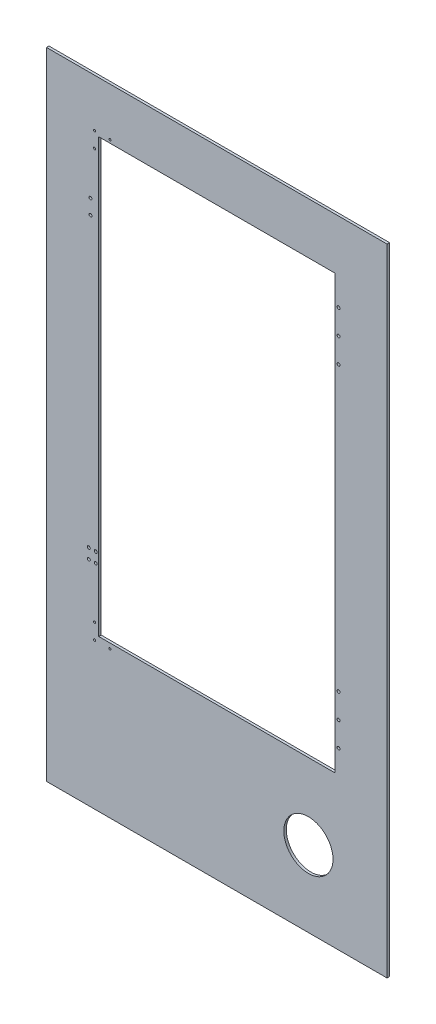
ISO-10303-21;
HEADER;
FILE_DESCRIPTION(('STEP AP214'),'2;1');
FILE_NAME('part.step','',(''),(''),'','','');
FILE_SCHEMA(('AUTOMOTIVE_DESIGN { 1 0 10303 214 1 1 1 1 }'));
ENDSEC;
DATA;
#1=APPLICATION_CONTEXT('core data for automotive mechanical design processes');
#2=APPLICATION_PROTOCOL_DEFINITION('international standard','automotive_design',2000,#1);
#3=PRODUCT_CONTEXT('',#1,'mechanical');
#4=PRODUCT('Part','Part','',(#3));
#5=PRODUCT_RELATED_PRODUCT_CATEGORY('part','',(#4));
#6=PRODUCT_DEFINITION_FORMATION('','',#4);
#7=PRODUCT_DEFINITION_CONTEXT('part definition',#1,'design');
#8=PRODUCT_DEFINITION('design','',#6,#7);
#9=PRODUCT_DEFINITION_SHAPE('','',#8);
#10=(LENGTH_UNIT() NAMED_UNIT(*) SI_UNIT(.MILLI.,.METRE.));
#11=(NAMED_UNIT(*) PLANE_ANGLE_UNIT() SI_UNIT($,.RADIAN.));
#12=(NAMED_UNIT(*) SI_UNIT($,.STERADIAN.) SOLID_ANGLE_UNIT());
#13=UNCERTAINTY_MEASURE_WITH_UNIT(LENGTH_MEASURE(1.E-05),#10,'distance_accuracy_value','');
#14=(GEOMETRIC_REPRESENTATION_CONTEXT(3) GLOBAL_UNCERTAINTY_ASSIGNED_CONTEXT((#13)) GLOBAL_UNIT_ASSIGNED_CONTEXT((#10,
#11,#12)) REPRESENTATION_CONTEXT('',''));
#15=CARTESIAN_POINT('',(0.,0.,0.));
#16=DIRECTION('',(0.,0.,1.));
#17=DIRECTION('',(1.,0.,0.));
#18=AXIS2_PLACEMENT_3D('',#15,#16,#17);
#19=CARTESIAN_POINT('',(879.7036,0.,6.35));
#20=DIRECTION('',(-1.,0.,0.));
#21=DIRECTION('',(0.,-1.,0.));
#22=AXIS2_PLACEMENT_3D('',#19,#20,#21);
#23=PLANE('',#22);
#24=DIRECTION('',(0.,1.,0.));
#25=VECTOR('',#24,1.);
#26=CARTESIAN_POINT('',(879.7036,0.,6.35));
#27=LINE('',#26,#25);
#28=CARTESIAN_POINT('',(879.7036,-1641.221,6.35));
#29=VERTEX_POINT('',#28);
#30=CARTESIAN_POINT('',(879.7036,-0.254,6.35));
#31=VERTEX_POINT('',#30);
#32=EDGE_CURVE('E163',#29,#31,#27,.T.);
#33=ORIENTED_EDGE('',*,*,#32,.F.);
#34=DIRECTION('',(0.,0.,-1.));
#35=VECTOR('',#34,1.);
#36=CARTESIAN_POINT('',(879.7036,-1641.221,6.35));
#37=LINE('',#36,#35);
#38=CARTESIAN_POINT('',(879.7036,-1641.221,0.));
#39=VERTEX_POINT('',#38);
#40=EDGE_CURVE('E188',#29,#39,#37,.T.);
#41=ORIENTED_EDGE('',*,*,#40,.T.);
#42=DIRECTION('',(0.,1.,0.));
#43=VECTOR('',#42,1.);
#44=CARTESIAN_POINT('',(879.7036,0.,0.));
#45=LINE('',#44,#43);
#46=CARTESIAN_POINT('',(879.7036,-0.254,0.));
#47=VERTEX_POINT('',#46);
#48=EDGE_CURVE('E159',#39,#47,#45,.T.);
#49=ORIENTED_EDGE('',*,*,#48,.T.);
#50=DIRECTION('',(0.,0.,-1.));
#51=VECTOR('',#50,1.);
#52=CARTESIAN_POINT('',(879.7036,-0.254,6.35));
#53=LINE('',#52,#51);
#54=EDGE_CURVE('E176',#47,#31,#53,.F.);
#55=ORIENTED_EDGE('',*,*,#54,.T.);
#56=EDGE_LOOP('',(#33,#41,#49,#55));
#57=FACE_BOUND('',#56,.T.);
#58=ADVANCED_FACE('F34',(#57),#23,.F.);
#59=CARTESIAN_POINT('',(0.,0.,6.35));
#60=DIRECTION('',(0.,-1.,0.));
#61=DIRECTION('',(0.,0.,-1.));
#62=AXIS2_PLACEMENT_3D('',#59,#60,#61);
#63=PLANE('',#62);
#64=DIRECTION('',(-1.,0.,0.));
#65=VECTOR('',#64,1.);
#66=CARTESIAN_POINT('',(0.,0.,0.));
#67=LINE('',#66,#65);
#68=CARTESIAN_POINT('',(879.4496,0.,0.));
#69=VERTEX_POINT('',#68);
#70=CARTESIAN_POINT('',(0.254,0.,0.));
#71=VERTEX_POINT('',#70);
#72=EDGE_CURVE('E179',#69,#71,#67,.T.);
#73=ORIENTED_EDGE('',*,*,#72,.T.);
#74=DIRECTION('',(0.,0.,-1.));
#75=VECTOR('',#74,1.);
#76=CARTESIAN_POINT('',(0.254,0.,6.35));
#77=LINE('',#76,#75);
#78=CARTESIAN_POINT('',(0.254,0.,6.35));
#79=VERTEX_POINT('',#78);
#80=EDGE_CURVE('E11',#71,#79,#77,.F.);
#81=ORIENTED_EDGE('',*,*,#80,.T.);
#82=DIRECTION('',(-1.,0.,0.));
#83=VECTOR('',#82,1.);
#84=CARTESIAN_POINT('',(0.,0.,6.35));
#85=LINE('',#84,#83);
#86=CARTESIAN_POINT('',(879.4496,0.,6.35));
#87=VERTEX_POINT('',#86);
#88=EDGE_CURVE('E166',#87,#79,#85,.T.);
#89=ORIENTED_EDGE('',*,*,#88,.F.);
#90=DIRECTION('',(0.,0.,-1.));
#91=VECTOR('',#90,1.);
#92=CARTESIAN_POINT('',(879.4496,0.,6.35));
#93=LINE('',#92,#91);
#94=EDGE_CURVE('E42',#87,#69,#93,.T.);
#95=ORIENTED_EDGE('',*,*,#94,.T.);
#96=EDGE_LOOP('',(#73,#81,#89,#95));
#97=FACE_BOUND('',#96,.T.);
#98=ADVANCED_FACE('F221',(#97),#63,.F.);
#99=CARTESIAN_POINT('',(0.,0.,6.35));
#100=DIRECTION('',(1.,0.,0.));
#101=DIRECTION('',(0.,1.,0.));
#102=AXIS2_PLACEMENT_3D('',#99,#100,#101);
#103=PLANE('',#102);
#104=DIRECTION('',(0.,-1.,0.));
#105=VECTOR('',#104,1.);
#106=CARTESIAN_POINT('',(0.,0.,0.));
#107=LINE('',#106,#105);
#108=CARTESIAN_POINT('',(0.,-0.254,0.));
#109=VERTEX_POINT('',#108);
#110=CARTESIAN_POINT('',(2.00991604434342E-13,-1641.221,0.));
#111=VERTEX_POINT('',#110);
#112=EDGE_CURVE('E182',#109,#111,#107,.T.);
#113=ORIENTED_EDGE('',*,*,#112,.T.);
#114=DIRECTION('',(0.,0.,-1.));
#115=VECTOR('',#114,1.);
#116=CARTESIAN_POINT('',(2.00991604434342E-13,-1641.221,6.35));
#117=LINE('',#116,#115);
#118=CARTESIAN_POINT('',(2.00991604434342E-13,-1641.221,6.35));
#119=VERTEX_POINT('',#118);
#120=EDGE_CURVE('E215',#111,#119,#117,.F.);
#121=ORIENTED_EDGE('',*,*,#120,.T.);
#122=DIRECTION('',(0.,-1.,0.));
#123=VECTOR('',#122,1.);
#124=CARTESIAN_POINT('',(0.,0.,6.35));
#125=LINE('',#124,#123);
#126=CARTESIAN_POINT('',(0.,-0.254,6.35));
#127=VERTEX_POINT('',#126);
#128=EDGE_CURVE('E170',#127,#119,#125,.T.);
#129=ORIENTED_EDGE('',*,*,#128,.F.);
#130=DIRECTION('',(0.,0.,-1.));
#131=VECTOR('',#130,1.);
#132=CARTESIAN_POINT('',(0.,-0.254,6.35));
#133=LINE('',#132,#131);
#134=EDGE_CURVE('E212',#127,#109,#133,.T.);
#135=ORIENTED_EDGE('',*,*,#134,.T.);
#136=EDGE_LOOP('',(#113,#121,#129,#135));
#137=FACE_BOUND('',#136,.T.);
#138=ADVANCED_FACE('F233',(#137),#103,.F.);
#139=CARTESIAN_POINT('',(2.0102271046304E-13,-1641.475,6.35));
#140=DIRECTION('',(0.,1.,0.));
#141=DIRECTION('',(0.,0.,1.));
#142=AXIS2_PLACEMENT_3D('',#139,#140,#141);
#143=PLANE('',#142);
#144=DIRECTION('',(1.,0.,0.));
#145=VECTOR('',#144,1.);
#146=CARTESIAN_POINT('',(2.0102271046304E-13,-1641.475,0.));
#147=LINE('',#146,#145);
#148=CARTESIAN_POINT('',(0.254000000000201,-1641.475,0.));
#149=VERTEX_POINT('',#148);
#150=CARTESIAN_POINT('',(879.4496,-1641.475,0.));
#151=VERTEX_POINT('',#150);
#152=EDGE_CURVE('E167',#149,#151,#147,.T.);
#153=ORIENTED_EDGE('',*,*,#152,.T.);
#154=DIRECTION('',(0.,0.,-1.));
#155=VECTOR('',#154,1.);
#156=CARTESIAN_POINT('',(879.4496,-1641.475,6.35));
#157=LINE('',#156,#155);
#158=CARTESIAN_POINT('',(879.4496,-1641.475,6.35));
#159=VERTEX_POINT('',#158);
#160=EDGE_CURVE('E202',#151,#159,#157,.F.);
#161=ORIENTED_EDGE('',*,*,#160,.T.);
#162=DIRECTION('',(1.,0.,0.));
#163=VECTOR('',#162,1.);
#164=CARTESIAN_POINT('',(2.0102271046304E-13,-1641.475,6.35));
#165=LINE('',#164,#163);
#166=CARTESIAN_POINT('',(0.254000000000201,-1641.475,6.35));
#167=VERTEX_POINT('',#166);
#168=EDGE_CURVE('E173',#167,#159,#165,.T.);
#169=ORIENTED_EDGE('',*,*,#168,.F.);
#170=DIRECTION('',(0.,0.,-1.));
#171=VECTOR('',#170,1.);
#172=CARTESIAN_POINT('',(0.254000000000201,-1641.475,6.35));
#173=LINE('',#172,#171);
#174=EDGE_CURVE('E199',#167,#149,#173,.T.);
#175=ORIENTED_EDGE('',*,*,#174,.T.);
#176=EDGE_LOOP('',(#153,#161,#169,#175));
#177=FACE_BOUND('',#176,.T.);
#178=ADVANCED_FACE('F244',(#177),#143,.F.);
#179=CARTESIAN_POINT('',(0.,0.,6.35));
#180=DIRECTION('',(0.,0.,1.));
#181=DIRECTION('',(1.,0.,0.));
#182=AXIS2_PLACEMENT_3D('',#179,#180,#181);
#183=PLANE('',#182);
#184=CARTESIAN_POINT('',(124.3,-1263.175,6.35));
#185=DIRECTION('',(0.,0.,-1.));
#186=DIRECTION('',(0.,1.,0.));
#187=AXIS2_PLACEMENT_3D('',#184,#185,#186);
#188=CIRCLE('',#187,2.70000000000002);
#189=CARTESIAN_POINT('',(124.3,-1260.475,6.35));
#190=VERTEX_POINT('',#189);
#191=EDGE_CURVE('E561',#190,#190,#188,.T.);
#192=ORIENTED_EDGE('',*,*,#191,.T.);
#193=EDGE_LOOP('',(#192));
#194=FACE_BOUND('',#193,.T.);
#195=CARTESIAN_POINT('',(163.924,-1263.175,6.35));
#196=DIRECTION('',(0.,0.,-1.));
#197=DIRECTION('',(0.,1.,0.));
#198=AXIS2_PLACEMENT_3D('',#195,#196,#197);
#199=CIRCLE('',#198,2.69999999999998);
#200=CARTESIAN_POINT('',(163.924,-1260.475,6.35));
#201=VERTEX_POINT('',#200);
#202=EDGE_CURVE('E565',#201,#201,#199,.T.);
#203=ORIENTED_EDGE('',*,*,#202,.T.);
#204=EDGE_LOOP('',(#203));
#205=FACE_BOUND('',#204,.T.);
#206=CARTESIAN_POINT('',(163.924,-124.3,6.35));
#207=DIRECTION('',(0.,0.,-1.));
#208=DIRECTION('',(0.,-1.,0.));
#209=AXIS2_PLACEMENT_3D('',#206,#207,#208);
#210=CIRCLE('',#209,2.69999999999998);
#211=CARTESIAN_POINT('',(163.924,-127.,6.35));
#212=VERTEX_POINT('',#211);
#213=EDGE_CURVE('E576',#212,#212,#210,.T.);
#214=ORIENTED_EDGE('',*,*,#213,.T.);
#215=EDGE_LOOP('',(#214));
#216=FACE_BOUND('',#215,.T.);
#217=CARTESIAN_POINT('',(124.3,-124.3,6.35));
#218=DIRECTION('',(0.,0.,-1.));
#219=DIRECTION('',(0.,-1.,0.));
#220=AXIS2_PLACEMENT_3D('',#217,#218,#219);
#221=CIRCLE('',#220,2.70000000000003);
#222=CARTESIAN_POINT('',(124.3,-127.,6.35));
#223=VERTEX_POINT('',#222);
#224=EDGE_CURVE('E582',#223,#223,#221,.T.);
#225=ORIENTED_EDGE('',*,*,#224,.T.);
#226=EDGE_LOOP('',(#225));
#227=FACE_BOUND('',#226,.T.);
#228=CARTESIAN_POINT('',(124.3,-163.924,6.35));
#229=DIRECTION('',(0.,0.,-1.));
#230=DIRECTION('',(0.,-1.,0.));
#231=AXIS2_PLACEMENT_3D('',#228,#229,#230);
#232=CIRCLE('',#231,2.70000000000001);
#233=CARTESIAN_POINT('',(124.3,-166.624,6.35));
#234=VERTEX_POINT('',#233);
#235=EDGE_CURVE('E588',#234,#234,#232,.T.);
#236=ORIENTED_EDGE('',*,*,#235,.T.);
#237=EDGE_LOOP('',(#236));
#238=FACE_BOUND('',#237,.T.);
#239=CARTESIAN_POINT('',(124.3,-1223.551,6.35));
#240=DIRECTION('',(0.,0.,-1.));
#241=DIRECTION('',(0.,1.,0.));
#242=AXIS2_PLACEMENT_3D('',#239,#240,#241);
#243=CIRCLE('',#242,2.70000000000001);
#244=CARTESIAN_POINT('',(124.3,-1220.851,6.35));
#245=VERTEX_POINT('',#244);
#246=EDGE_CURVE('E589',#245,#245,#243,.T.);
#247=ORIENTED_EDGE('',*,*,#246,.T.);
#248=EDGE_LOOP('',(#247));
#249=FACE_BOUND('',#248,.T.);
#250=CARTESIAN_POINT('',(676.5036,-1445.7045,6.35));
#251=DIRECTION('',(0.,0.,1.));
#252=DIRECTION('',(1.,0.,0.));
#253=AXIS2_PLACEMENT_3D('',#250,#251,#252);
#254=CIRCLE('',#253,63.4999999999998);
#255=CARTESIAN_POINT('',(740.0036,-1445.7045,6.35));
#256=VERTEX_POINT('',#255);
#257=EDGE_CURVE('E592',#256,#256,#254,.T.);
#258=ORIENTED_EDGE('',*,*,#257,.F.);
#259=EDGE_LOOP('',(#258));
#260=FACE_BOUND('',#259,.T.);
#261=CARTESIAN_POINT('',(754.354600000134,-204.724000000096,6.35));
#262=DIRECTION('',(0.,0.,1.));
#263=DIRECTION('',(1.,0.,0.));
#264=AXIS2_PLACEMENT_3D('',#261,#262,#263);
#265=CIRCLE('',#264,3.80999999999998);
#266=CARTESIAN_POINT('',(758.164600000134,-204.724000000096,6.35));
#267=VERTEX_POINT('',#266);
#268=EDGE_CURVE('E603',#267,#267,#265,.T.);
#269=ORIENTED_EDGE('',*,*,#268,.F.);
#270=EDGE_LOOP('',(#269));
#271=FACE_BOUND('',#270,.T.);
#272=CARTESIAN_POINT('',(113.748448168368,-280.289,6.35));
#273=DIRECTION('',(0.,0.,1.));
#274=DIRECTION('',(1.,0.,0.));
#275=AXIS2_PLACEMENT_3D('',#272,#273,#274);
#276=CIRCLE('',#275,3.81);
#277=CARTESIAN_POINT('',(117.558448168367,-280.289,6.35));
#278=VERTEX_POINT('',#277);
#279=EDGE_CURVE('E598',#278,#278,#276,.T.);
#280=ORIENTED_EDGE('',*,*,#279,.F.);
#281=EDGE_LOOP('',(#280));
#282=FACE_BOUND('',#281,.T.);
#283=CARTESIAN_POINT('',(113.748448168368,-318.389,6.35));
#284=DIRECTION('',(0.,0.,1.));
#285=DIRECTION('',(1.,0.,0.));
#286=AXIS2_PLACEMENT_3D('',#283,#284,#285);
#287=CIRCLE('',#286,3.81);
#288=CARTESIAN_POINT('',(117.558448168367,-318.389,6.35));
#289=VERTEX_POINT('',#288);
#290=EDGE_CURVE('E617',#289,#289,#287,.T.);
#291=ORIENTED_EDGE('',*,*,#290,.F.);
#292=EDGE_LOOP('',(#291));
#293=FACE_BOUND('',#292,.T.);
#294=CARTESIAN_POINT('',(109.383049966,-1089.8630002661,6.35));
#295=DIRECTION('',(0.,0.,1.));
#296=DIRECTION('',(1.,0.,0.));
#297=AXIS2_PLACEMENT_3D('',#294,#295,#296);
#298=CIRCLE('',#297,3.81000000000003);
#299=CARTESIAN_POINT('',(113.193049966,-1089.8630002661,6.35));
#300=VERTEX_POINT('',#299);
#301=EDGE_CURVE('E611',#300,#300,#298,.T.);
#302=ORIENTED_EDGE('',*,*,#301,.F.);
#303=EDGE_LOOP('',(#302));
#304=FACE_BOUND('',#303,.T.);
#305=CARTESIAN_POINT('',(754.354600000134,-268.224000000096,6.35));
#306=DIRECTION('',(0.,0.,1.));
#307=DIRECTION('',(1.,0.,0.));
#308=AXIS2_PLACEMENT_3D('',#305,#306,#307);
#309=CIRCLE('',#308,3.80999999999998);
#310=CARTESIAN_POINT('',(758.164600000134,-268.224000000096,6.35));
#311=VERTEX_POINT('',#310);
#312=EDGE_CURVE('E650',#311,#311,#309,.T.);
#313=ORIENTED_EDGE('',*,*,#312,.F.);
#314=EDGE_LOOP('',(#313));
#315=FACE_BOUND('',#314,.T.);
#316=CARTESIAN_POINT('',(754.354600000134,-331.724000000096,6.35));
#317=DIRECTION('',(0.,0.,1.));
#318=DIRECTION('',(1.,0.,0.));
#319=AXIS2_PLACEMENT_3D('',#316,#317,#318);
#320=CIRCLE('',#319,3.80999999999998);
#321=CARTESIAN_POINT('',(758.164600000134,-331.724000000096,6.35));
#322=VERTEX_POINT('',#321);
#323=EDGE_CURVE('E656',#322,#322,#320,.T.);
#324=ORIENTED_EDGE('',*,*,#323,.F.);
#325=EDGE_LOOP('',(#324));
#326=FACE_BOUND('',#325,.T.);
#327=CARTESIAN_POINT('',(754.354600000134,-1190.2440000001,6.35));
#328=DIRECTION('',(0.,0.,1.));
#329=DIRECTION('',(1.,0.,0.));
#330=AXIS2_PLACEMENT_3D('',#327,#328,#329);
#331=CIRCLE('',#330,3.81);
#332=CARTESIAN_POINT('',(758.164600000134,-1190.2440000001,6.35));
#333=VERTEX_POINT('',#332);
#334=EDGE_CURVE('E662',#333,#333,#331,.T.);
#335=ORIENTED_EDGE('',*,*,#334,.F.);
#336=EDGE_LOOP('',(#335));
#337=FACE_BOUND('',#336,.T.);
#338=CARTESIAN_POINT('',(754.354600000134,-1126.7440000001,6.35));
#339=DIRECTION('',(0.,0.,1.));
#340=DIRECTION('',(1.,0.,0.));
#341=AXIS2_PLACEMENT_3D('',#338,#339,#340);
#342=CIRCLE('',#341,3.81);
#343=CARTESIAN_POINT('',(758.164600000134,-1126.7440000001,6.35));
#344=VERTEX_POINT('',#343);
#345=EDGE_CURVE('E146',#344,#344,#342,.T.);
#346=ORIENTED_EDGE('',*,*,#345,.F.);
#347=EDGE_LOOP('',(#346));
#348=FACE_BOUND('',#347,.T.);
#349=CARTESIAN_POINT('',(127.383050034,-1089.8630002661,6.35));
#350=DIRECTION('',(0.,0.,1.));
#351=DIRECTION('',(1.,0.,0.));
#352=AXIS2_PLACEMENT_3D('',#349,#350,#351);
#353=CIRCLE('',#352,3.8100000000001);
#354=CARTESIAN_POINT('',(131.193050034,-1089.8630002661,6.35));
#355=VERTEX_POINT('',#354);
#356=EDGE_CURVE('E610',#355,#355,#353,.T.);
#357=ORIENTED_EDGE('',*,*,#356,.F.);
#358=EDGE_LOOP('',(#357));
#359=FACE_BOUND('',#358,.T.);
#360=CARTESIAN_POINT('',(127.383050034,-1063.8630001961,6.35));
#361=DIRECTION('',(0.,0.,1.));
#362=DIRECTION('',(1.,0.,0.));
#363=AXIS2_PLACEMENT_3D('',#360,#361,#362);
#364=CIRCLE('',#363,3.8100000000001);
#365=CARTESIAN_POINT('',(131.193050034,-1063.8630001961,6.35));
#366=VERTEX_POINT('',#365);
#367=EDGE_CURVE('E629',#366,#366,#364,.T.);
#368=ORIENTED_EDGE('',*,*,#367,.F.);
#369=EDGE_LOOP('',(#368));
#370=FACE_BOUND('',#369,.T.);
#371=CARTESIAN_POINT('',(109.383049966,-1063.8630001961,6.35));
#372=DIRECTION('',(0.,0.,1.));
#373=DIRECTION('',(1.,0.,0.));
#374=AXIS2_PLACEMENT_3D('',#371,#372,#373);
#375=CIRCLE('',#374,3.81000000000003);
#376=CARTESIAN_POINT('',(113.193049966,-1063.8630001961,6.35));
#377=VERTEX_POINT('',#376);
#378=EDGE_CURVE('E628',#377,#377,#375,.T.);
#379=ORIENTED_EDGE('',*,*,#378,.F.);
#380=EDGE_LOOP('',(#379));
#381=FACE_BOUND('',#380,.T.);
#382=CARTESIAN_POINT('',(754.354600000134,-1063.2440000001,6.35));
#383=DIRECTION('',(0.,0.,1.));
#384=DIRECTION('',(1.,0.,0.));
#385=AXIS2_PLACEMENT_3D('',#382,#383,#384);
#386=CIRCLE('',#385,3.81);
#387=CARTESIAN_POINT('',(758.164600000134,-1063.2440000001,6.35));
#388=VERTEX_POINT('',#387);
#389=EDGE_CURVE('E640',#388,#388,#386,.T.);
#390=ORIENTED_EDGE('',*,*,#389,.F.);
#391=EDGE_LOOP('',(#390));
#392=FACE_BOUND('',#391,.T.);
#393=DIRECTION('',(0.,-1.,0.));
#394=VECTOR('',#393,1.);
#395=CARTESIAN_POINT('',(135.0518,-132.334,6.35));
#396=LINE('',#395,#394);
#397=CARTESIAN_POINT('',(135.0518,-132.334,6.35));
#398=VERTEX_POINT('',#397);
#399=CARTESIAN_POINT('',(135.0518,-1249.934,6.35));
#400=VERTEX_POINT('',#399);
#401=EDGE_CURVE('E49',#398,#400,#396,.T.);
#402=ORIENTED_EDGE('',*,*,#401,.F.);
#403=DIRECTION('',(-1.,0.,0.));
#404=VECTOR('',#403,1.);
#405=CARTESIAN_POINT('',(135.0518,-132.334,6.35));
#406=LINE('',#405,#404);
#407=CARTESIAN_POINT('',(744.6518,-132.334,6.35));
#408=VERTEX_POINT('',#407);
#409=EDGE_CURVE('E140',#408,#398,#406,.T.);
#410=ORIENTED_EDGE('',*,*,#409,.F.);
#411=DIRECTION('',(0.,1.,0.));
#412=VECTOR('',#411,1.);
#413=CARTESIAN_POINT('',(744.6518,-132.334,6.35));
#414=LINE('',#413,#412);
#415=CARTESIAN_POINT('',(744.6518,-1249.934,6.35));
#416=VERTEX_POINT('',#415);
#417=EDGE_CURVE('E143',#416,#408,#414,.T.);
#418=ORIENTED_EDGE('',*,*,#417,.F.);
#419=DIRECTION('',(1.,0.,0.));
#420=VECTOR('',#419,1.);
#421=CARTESIAN_POINT('',(135.0518,-1249.934,6.35));
#422=LINE('',#421,#420);
#423=EDGE_CURVE('E152',#400,#416,#422,.T.);
#424=ORIENTED_EDGE('',*,*,#423,.F.);
#425=EDGE_LOOP('',(#402,#410,#418,#424));
#426=FACE_BOUND('',#425,.T.);
#427=ORIENTED_EDGE('',*,*,#168,.T.);
#428=CARTESIAN_POINT('',(879.4496,-1641.221,6.35));
#429=DIRECTION('',(0.,0.,1.));
#430=DIRECTION('',(1.,0.,0.));
#431=AXIS2_PLACEMENT_3D('',#428,#429,#430);
#432=CIRCLE('',#431,0.254);
#433=EDGE_CURVE('E210',#159,#29,#432,.T.);
#434=ORIENTED_EDGE('',*,*,#433,.T.);
#435=ORIENTED_EDGE('',*,*,#32,.T.);
#436=CARTESIAN_POINT('',(879.4496,-0.254,6.35));
#437=DIRECTION('',(0.,0.,1.));
#438=DIRECTION('',(1.,0.,0.));
#439=AXIS2_PLACEMENT_3D('',#436,#437,#438);
#440=CIRCLE('',#439,0.254);
#441=EDGE_CURVE('E204',#31,#87,#440,.T.);
#442=ORIENTED_EDGE('',*,*,#441,.T.);
#443=ORIENTED_EDGE('',*,*,#88,.T.);
#444=CARTESIAN_POINT('',(0.254,-0.254,6.35));
#445=DIRECTION('',(0.,0.,1.));
#446=DIRECTION('',(1.,0.,0.));
#447=AXIS2_PLACEMENT_3D('',#444,#445,#446);
#448=CIRCLE('',#447,0.254);
#449=EDGE_CURVE('E206',#79,#127,#448,.T.);
#450=ORIENTED_EDGE('',*,*,#449,.T.);
#451=ORIENTED_EDGE('',*,*,#128,.T.);
#452=CARTESIAN_POINT('',(0.254000000000201,-1641.221,6.35));
#453=DIRECTION('',(0.,0.,1.));
#454=DIRECTION('',(1.,0.,0.));
#455=AXIS2_PLACEMENT_3D('',#452,#453,#454);
#456=CIRCLE('',#455,0.254);
#457=EDGE_CURVE('E208',#119,#167,#456,.T.);
#458=ORIENTED_EDGE('',*,*,#457,.T.);
#459=EDGE_LOOP('',(#427,#434,#435,#442,#443,#450,#451,#458));
#460=FACE_BOUND('',#459,.T.);
#461=ADVANCED_FACE('F237',(#194,#205,#216,#227,#238,#249,#260,#271,#282,#293,#304,#315,#326,
#337,#348,#359,#370,#381,#392,#426,#460),#183,.T.);
#462=CARTESIAN_POINT('',(0.,0.,0.));
#463=DIRECTION('',(0.,0.,1.));
#464=DIRECTION('',(1.,0.,0.));
#465=AXIS2_PLACEMENT_3D('',#462,#463,#464);
#466=PLANE('',#465);
#467=CARTESIAN_POINT('',(124.3,-1263.175,0.));
#468=DIRECTION('',(0.,0.,-1.));
#469=DIRECTION('',(0.,1.,0.));
#470=AXIS2_PLACEMENT_3D('',#467,#468,#469);
#471=CIRCLE('',#470,2.70000000000002);
#472=CARTESIAN_POINT('',(124.3,-1260.475,0.));
#473=VERTEX_POINT('',#472);
#474=EDGE_CURVE('E564',#473,#473,#471,.T.);
#475=ORIENTED_EDGE('',*,*,#474,.F.);
#476=EDGE_LOOP('',(#475));
#477=FACE_BOUND('',#476,.T.);
#478=CARTESIAN_POINT('',(163.924,-1263.175,0.));
#479=DIRECTION('',(0.,0.,-1.));
#480=DIRECTION('',(0.,1.,0.));
#481=AXIS2_PLACEMENT_3D('',#478,#479,#480);
#482=CIRCLE('',#481,2.69999999999998);
#483=CARTESIAN_POINT('',(163.924,-1260.475,0.));
#484=VERTEX_POINT('',#483);
#485=EDGE_CURVE('E570',#484,#484,#482,.T.);
#486=ORIENTED_EDGE('',*,*,#485,.F.);
#487=EDGE_LOOP('',(#486));
#488=FACE_BOUND('',#487,.T.);
#489=CARTESIAN_POINT('',(163.924,-124.3,0.));
#490=DIRECTION('',(0.,0.,-1.));
#491=DIRECTION('',(0.,-1.,0.));
#492=AXIS2_PLACEMENT_3D('',#489,#490,#491);
#493=CIRCLE('',#492,2.69999999999998);
#494=CARTESIAN_POINT('',(163.924,-127.,0.));
#495=VERTEX_POINT('',#494);
#496=EDGE_CURVE('E579',#495,#495,#493,.T.);
#497=ORIENTED_EDGE('',*,*,#496,.F.);
#498=EDGE_LOOP('',(#497));
#499=FACE_BOUND('',#498,.T.);
#500=CARTESIAN_POINT('',(124.3,-124.3,0.));
#501=DIRECTION('',(0.,0.,-1.));
#502=DIRECTION('',(0.,-1.,0.));
#503=AXIS2_PLACEMENT_3D('',#500,#501,#502);
#504=CIRCLE('',#503,2.70000000000003);
#505=CARTESIAN_POINT('',(124.3,-127.,0.));
#506=VERTEX_POINT('',#505);
#507=EDGE_CURVE('E585',#506,#506,#504,.T.);
#508=ORIENTED_EDGE('',*,*,#507,.F.);
#509=EDGE_LOOP('',(#508));
#510=FACE_BOUND('',#509,.T.);
#511=CARTESIAN_POINT('',(124.3,-163.924,0.));
#512=DIRECTION('',(0.,0.,-1.));
#513=DIRECTION('',(0.,-1.,0.));
#514=AXIS2_PLACEMENT_3D('',#511,#512,#513);
#515=CIRCLE('',#514,2.70000000000001);
#516=CARTESIAN_POINT('',(124.3,-166.624,0.));
#517=VERTEX_POINT('',#516);
#518=EDGE_CURVE('E743',#517,#517,#515,.T.);
#519=ORIENTED_EDGE('',*,*,#518,.F.);
#520=EDGE_LOOP('',(#519));
#521=FACE_BOUND('',#520,.T.);
#522=CARTESIAN_POINT('',(124.3,-1223.551,0.));
#523=DIRECTION('',(0.,0.,-1.));
#524=DIRECTION('',(0.,1.,0.));
#525=AXIS2_PLACEMENT_3D('',#522,#523,#524);
#526=CIRCLE('',#525,2.70000000000001);
#527=CARTESIAN_POINT('',(124.3,-1220.851,0.));
#528=VERTEX_POINT('',#527);
#529=EDGE_CURVE('E567',#528,#528,#526,.T.);
#530=ORIENTED_EDGE('',*,*,#529,.F.);
#531=EDGE_LOOP('',(#530));
#532=FACE_BOUND('',#531,.T.);
#533=CARTESIAN_POINT('',(676.5036,-1445.7045,0.));
#534=DIRECTION('',(0.,0.,1.));
#535=DIRECTION('',(1.,0.,0.));
#536=AXIS2_PLACEMENT_3D('',#533,#534,#535);
#537=CIRCLE('',#536,63.4999999999998);
#538=CARTESIAN_POINT('',(740.0036,-1445.7045,0.));
#539=VERTEX_POINT('',#538);
#540=EDGE_CURVE('E595',#539,#539,#537,.T.);
#541=ORIENTED_EDGE('',*,*,#540,.T.);
#542=EDGE_LOOP('',(#541));
#543=FACE_BOUND('',#542,.T.);
#544=CARTESIAN_POINT('',(754.354600000134,-204.724000000096,0.));
#545=DIRECTION('',(0.,0.,1.));
#546=DIRECTION('',(1.,0.,0.));
#547=AXIS2_PLACEMENT_3D('',#544,#545,#546);
#548=CIRCLE('',#547,3.80999999999998);
#549=CARTESIAN_POINT('',(758.164600000134,-204.724000000096,0.));
#550=VERTEX_POINT('',#549);
#551=EDGE_CURVE('E153',#550,#550,#548,.T.);
#552=ORIENTED_EDGE('',*,*,#551,.T.);
#553=EDGE_LOOP('',(#552));
#554=FACE_BOUND('',#553,.T.);
#555=CARTESIAN_POINT('',(113.748448168368,-280.289,0.));
#556=DIRECTION('',(0.,0.,1.));
#557=DIRECTION('',(1.,0.,0.));
#558=AXIS2_PLACEMENT_3D('',#555,#556,#557);
#559=CIRCLE('',#558,3.81);
#560=CARTESIAN_POINT('',(117.558448168367,-280.289,0.));
#561=VERTEX_POINT('',#560);
#562=EDGE_CURVE('E620',#561,#561,#559,.T.);
#563=ORIENTED_EDGE('',*,*,#562,.T.);
#564=EDGE_LOOP('',(#563));
#565=FACE_BOUND('',#564,.T.);
#566=CARTESIAN_POINT('',(113.748448168368,-318.389,0.));
#567=DIRECTION('',(0.,0.,1.));
#568=DIRECTION('',(1.,0.,0.));
#569=AXIS2_PLACEMENT_3D('',#566,#567,#568);
#570=CIRCLE('',#569,3.81);
#571=CARTESIAN_POINT('',(117.558448168367,-318.389,0.));
#572=VERTEX_POINT('',#571);
#573=EDGE_CURVE('E614',#572,#572,#570,.T.);
#574=ORIENTED_EDGE('',*,*,#573,.T.);
#575=EDGE_LOOP('',(#574));
#576=FACE_BOUND('',#575,.T.);
#577=CARTESIAN_POINT('',(109.383049966,-1089.8630002661,0.));
#578=DIRECTION('',(0.,0.,1.));
#579=DIRECTION('',(1.,0.,0.));
#580=AXIS2_PLACEMENT_3D('',#577,#578,#579);
#581=CIRCLE('',#580,3.81000000000003);
#582=CARTESIAN_POINT('',(113.193049966,-1089.8630002661,0.));
#583=VERTEX_POINT('',#582);
#584=EDGE_CURVE('E607',#583,#583,#581,.T.);
#585=ORIENTED_EDGE('',*,*,#584,.T.);
#586=EDGE_LOOP('',(#585));
#587=FACE_BOUND('',#586,.T.);
#588=CARTESIAN_POINT('',(754.354600000134,-268.224000000096,0.));
#589=DIRECTION('',(0.,0.,1.));
#590=DIRECTION('',(1.,0.,0.));
#591=AXIS2_PLACEMENT_3D('',#588,#589,#590);
#592=CIRCLE('',#591,3.80999999999998);
#593=CARTESIAN_POINT('',(758.164600000134,-268.224000000096,0.));
#594=VERTEX_POINT('',#593);
#595=EDGE_CURVE('E606',#594,#594,#592,.T.);
#596=ORIENTED_EDGE('',*,*,#595,.T.);
#597=EDGE_LOOP('',(#596));
#598=FACE_BOUND('',#597,.T.);
#599=CARTESIAN_POINT('',(754.354600000134,-331.724000000096,0.));
#600=DIRECTION('',(0.,0.,1.));
#601=DIRECTION('',(1.,0.,0.));
#602=AXIS2_PLACEMENT_3D('',#599,#600,#601);
#603=CIRCLE('',#602,3.80999999999998);
#604=CARTESIAN_POINT('',(758.164600000134,-331.724000000096,0.));
#605=VERTEX_POINT('',#604);
#606=EDGE_CURVE('E653',#605,#605,#603,.T.);
#607=ORIENTED_EDGE('',*,*,#606,.T.);
#608=EDGE_LOOP('',(#607));
#609=FACE_BOUND('',#608,.T.);
#610=CARTESIAN_POINT('',(754.354600000134,-1190.2440000001,0.));
#611=DIRECTION('',(0.,0.,1.));
#612=DIRECTION('',(1.,0.,0.));
#613=AXIS2_PLACEMENT_3D('',#610,#611,#612);
#614=CIRCLE('',#613,3.81);
#615=CARTESIAN_POINT('',(758.164600000134,-1190.2440000001,0.));
#616=VERTEX_POINT('',#615);
#617=EDGE_CURVE('E659',#616,#616,#614,.T.);
#618=ORIENTED_EDGE('',*,*,#617,.T.);
#619=EDGE_LOOP('',(#618));
#620=FACE_BOUND('',#619,.T.);
#621=CARTESIAN_POINT('',(754.354600000134,-1126.7440000001,0.));
#622=DIRECTION('',(0.,0.,1.));
#623=DIRECTION('',(1.,0.,0.));
#624=AXIS2_PLACEMENT_3D('',#621,#622,#623);
#625=CIRCLE('',#624,3.81);
#626=CARTESIAN_POINT('',(758.164600000134,-1126.7440000001,0.));
#627=VERTEX_POINT('',#626);
#628=EDGE_CURVE('E664',#627,#627,#625,.T.);
#629=ORIENTED_EDGE('',*,*,#628,.T.);
#630=EDGE_LOOP('',(#629));
#631=FACE_BOUND('',#630,.T.);
#632=CARTESIAN_POINT('',(127.383050034,-1089.8630002661,0.));
#633=DIRECTION('',(0.,0.,1.));
#634=DIRECTION('',(1.,0.,0.));
#635=AXIS2_PLACEMENT_3D('',#632,#633,#634);
#636=CIRCLE('',#635,3.8100000000001);
#637=CARTESIAN_POINT('',(131.193050034,-1089.8630002661,0.));
#638=VERTEX_POINT('',#637);
#639=EDGE_CURVE('E632',#638,#638,#636,.T.);
#640=ORIENTED_EDGE('',*,*,#639,.T.);
#641=EDGE_LOOP('',(#640));
#642=FACE_BOUND('',#641,.T.);
#643=CARTESIAN_POINT('',(127.383050034,-1063.8630001961,0.));
#644=DIRECTION('',(0.,0.,1.));
#645=DIRECTION('',(1.,0.,0.));
#646=AXIS2_PLACEMENT_3D('',#643,#644,#645);
#647=CIRCLE('',#646,3.8100000000001);
#648=CARTESIAN_POINT('',(131.193050034,-1063.8630001961,0.));
#649=VERTEX_POINT('',#648);
#650=EDGE_CURVE('E625',#649,#649,#647,.T.);
#651=ORIENTED_EDGE('',*,*,#650,.T.);
#652=EDGE_LOOP('',(#651));
#653=FACE_BOUND('',#652,.T.);
#654=CARTESIAN_POINT('',(109.383049966,-1063.8630001961,0.));
#655=DIRECTION('',(0.,0.,1.));
#656=DIRECTION('',(1.,0.,0.));
#657=AXIS2_PLACEMENT_3D('',#654,#655,#656);
#658=CIRCLE('',#657,3.81000000000003);
#659=CARTESIAN_POINT('',(113.193049966,-1063.8630001961,0.));
#660=VERTEX_POINT('',#659);
#661=EDGE_CURVE('E643',#660,#660,#658,.T.);
#662=ORIENTED_EDGE('',*,*,#661,.T.);
#663=EDGE_LOOP('',(#662));
#664=FACE_BOUND('',#663,.T.);
#665=CARTESIAN_POINT('',(754.354600000134,-1063.2440000001,0.));
#666=DIRECTION('',(0.,0.,1.));
#667=DIRECTION('',(1.,0.,0.));
#668=AXIS2_PLACEMENT_3D('',#665,#666,#667);
#669=CIRCLE('',#668,3.81);
#670=CARTESIAN_POINT('',(758.164600000134,-1063.2440000001,0.));
#671=VERTEX_POINT('',#670);
#672=EDGE_CURVE('E637',#671,#671,#669,.T.);
#673=ORIENTED_EDGE('',*,*,#672,.T.);
#674=EDGE_LOOP('',(#673));
#675=FACE_BOUND('',#674,.T.);
#676=DIRECTION('',(-1.,0.,0.));
#677=VECTOR('',#676,1.);
#678=CARTESIAN_POINT('',(135.0518,-132.334,0.));
#679=LINE('',#678,#677);
#680=CARTESIAN_POINT('',(744.6518,-132.334,0.));
#681=VERTEX_POINT('',#680);
#682=CARTESIAN_POINT('',(135.0518,-132.334,0.));
#683=VERTEX_POINT('',#682);
#684=EDGE_CURVE('E130',#681,#683,#679,.T.);
#685=ORIENTED_EDGE('',*,*,#684,.T.);
#686=DIRECTION('',(0.,-1.,0.));
#687=VECTOR('',#686,1.);
#688=CARTESIAN_POINT('',(135.0518,-132.334,0.));
#689=LINE('',#688,#687);
#690=CARTESIAN_POINT('',(135.0518,-1249.934,0.));
#691=VERTEX_POINT('',#690);
#692=EDGE_CURVE('E124',#683,#691,#689,.T.);
#693=ORIENTED_EDGE('',*,*,#692,.T.);
#694=DIRECTION('',(1.,0.,0.));
#695=VECTOR('',#694,1.);
#696=CARTESIAN_POINT('',(135.0518,-1249.934,0.));
#697=LINE('',#696,#695);
#698=CARTESIAN_POINT('',(744.6518,-1249.934,0.));
#699=VERTEX_POINT('',#698);
#700=EDGE_CURVE('E133',#691,#699,#697,.T.);
#701=ORIENTED_EDGE('',*,*,#700,.T.);
#702=DIRECTION('',(0.,1.,0.));
#703=VECTOR('',#702,1.);
#704=CARTESIAN_POINT('',(744.6518,-132.334,0.));
#705=LINE('',#704,#703);
#706=EDGE_CURVE('E57',#699,#681,#705,.T.);
#707=ORIENTED_EDGE('',*,*,#706,.T.);
#708=EDGE_LOOP('',(#685,#693,#701,#707));
#709=FACE_BOUND('',#708,.T.);
#710=ORIENTED_EDGE('',*,*,#48,.F.);
#711=CARTESIAN_POINT('',(879.4496,-1641.221,0.));
#712=DIRECTION('',(0.,0.,1.));
#713=DIRECTION('',(1.,0.,0.));
#714=AXIS2_PLACEMENT_3D('',#711,#712,#713);
#715=CIRCLE('',#714,0.254);
#716=EDGE_CURVE('E197',#39,#151,#715,.F.);
#717=ORIENTED_EDGE('',*,*,#716,.T.);
#718=ORIENTED_EDGE('',*,*,#152,.F.);
#719=CARTESIAN_POINT('',(0.254000000000201,-1641.221,0.));
#720=DIRECTION('',(0.,0.,1.));
#721=DIRECTION('',(1.,0.,0.));
#722=AXIS2_PLACEMENT_3D('',#719,#720,#721);
#723=CIRCLE('',#722,0.254);
#724=EDGE_CURVE('E195',#149,#111,#723,.F.);
#725=ORIENTED_EDGE('',*,*,#724,.T.);
#726=ORIENTED_EDGE('',*,*,#112,.F.);
#727=CARTESIAN_POINT('',(0.254,-0.254,0.));
#728=DIRECTION('',(0.,0.,1.));
#729=DIRECTION('',(1.,0.,0.));
#730=AXIS2_PLACEMENT_3D('',#727,#728,#729);
#731=CIRCLE('',#730,0.254);
#732=EDGE_CURVE('E193',#109,#71,#731,.F.);
#733=ORIENTED_EDGE('',*,*,#732,.T.);
#734=ORIENTED_EDGE('',*,*,#72,.F.);
#735=CARTESIAN_POINT('',(879.4496,-0.254,0.));
#736=DIRECTION('',(0.,0.,1.));
#737=DIRECTION('',(1.,0.,0.));
#738=AXIS2_PLACEMENT_3D('',#735,#736,#737);
#739=CIRCLE('',#738,0.254);
#740=EDGE_CURVE('E191',#69,#47,#739,.F.);
#741=ORIENTED_EDGE('',*,*,#740,.T.);
#742=EDGE_LOOP('',(#710,#717,#718,#725,#726,#733,#734,#741));
#743=FACE_BOUND('',#742,.T.);
#744=ADVANCED_FACE('F137',(#477,#488,#499,#510,#521,#532,#543,#554,#565,#576,#587,#598,#609,
#620,#631,#642,#653,#664,#675,#709,#743),#466,.F.);
#745=CARTESIAN_POINT('',(879.4496,-1641.221,6.35));
#746=DIRECTION('',(0.,0.,-1.));
#747=DIRECTION('',(-1.,0.,0.));
#748=AXIS2_PLACEMENT_3D('',#745,#746,#747);
#749=CYLINDRICAL_SURFACE('',#748,0.254);
#750=ORIENTED_EDGE('',*,*,#433,.F.);
#751=ORIENTED_EDGE('',*,*,#160,.F.);
#752=ORIENTED_EDGE('',*,*,#716,.F.);
#753=ORIENTED_EDGE('',*,*,#40,.F.);
#754=EDGE_LOOP('',(#750,#751,#752,#753));
#755=FACE_BOUND('',#754,.T.);
#756=ADVANCED_FACE('F249',(#755),#749,.T.);
#757=CARTESIAN_POINT('',(0.254000000000201,-1641.221,6.35));
#758=DIRECTION('',(0.,0.,-1.));
#759=DIRECTION('',(-1.,0.,0.));
#760=AXIS2_PLACEMENT_3D('',#757,#758,#759);
#761=CYLINDRICAL_SURFACE('',#760,0.254);
#762=ORIENTED_EDGE('',*,*,#457,.F.);
#763=ORIENTED_EDGE('',*,*,#120,.F.);
#764=ORIENTED_EDGE('',*,*,#724,.F.);
#765=ORIENTED_EDGE('',*,*,#174,.F.);
#766=EDGE_LOOP('',(#762,#763,#764,#765));
#767=FACE_BOUND('',#766,.T.);
#768=ADVANCED_FACE('F241',(#767),#761,.T.);
#769=CARTESIAN_POINT('',(0.254,-0.254,6.35));
#770=DIRECTION('',(0.,0.,-1.));
#771=DIRECTION('',(-1.,0.,0.));
#772=AXIS2_PLACEMENT_3D('',#769,#770,#771);
#773=CYLINDRICAL_SURFACE('',#772,0.254);
#774=ORIENTED_EDGE('',*,*,#449,.F.);
#775=ORIENTED_EDGE('',*,*,#80,.F.);
#776=ORIENTED_EDGE('',*,*,#732,.F.);
#777=ORIENTED_EDGE('',*,*,#134,.F.);
#778=EDGE_LOOP('',(#774,#775,#776,#777));
#779=FACE_BOUND('',#778,.T.);
#780=ADVANCED_FACE('F230',(#779),#773,.T.);
#781=CARTESIAN_POINT('',(879.4496,-0.254,6.35));
#782=DIRECTION('',(0.,0.,-1.));
#783=DIRECTION('',(-1.,0.,0.));
#784=AXIS2_PLACEMENT_3D('',#781,#782,#783);
#785=CYLINDRICAL_SURFACE('',#784,0.254);
#786=ORIENTED_EDGE('',*,*,#441,.F.);
#787=ORIENTED_EDGE('',*,*,#54,.F.);
#788=ORIENTED_EDGE('',*,*,#740,.F.);
#789=ORIENTED_EDGE('',*,*,#94,.F.);
#790=EDGE_LOOP('',(#786,#787,#788,#789));
#791=FACE_BOUND('',#790,.T.);
#792=ADVANCED_FACE('F36',(#791),#785,.T.);
#793=CARTESIAN_POINT('',(135.0518,-132.334,0.));
#794=DIRECTION('',(-1.,0.,0.));
#795=DIRECTION('',(0.,-1.,0.));
#796=AXIS2_PLACEMENT_3D('',#793,#794,#795);
#797=PLANE('',#796);
#798=ORIENTED_EDGE('',*,*,#401,.T.);
#799=DIRECTION('',(0.,0.,1.));
#800=VECTOR('',#799,1.);
#801=CARTESIAN_POINT('',(135.0518,-1249.934,0.));
#802=LINE('',#801,#800);
#803=EDGE_CURVE('E120',#691,#400,#802,.T.);
#804=ORIENTED_EDGE('',*,*,#803,.F.);
#805=ORIENTED_EDGE('',*,*,#692,.F.);
#806=DIRECTION('',(0.,0.,1.));
#807=VECTOR('',#806,1.);
#808=CARTESIAN_POINT('',(135.0518,-132.334,0.));
#809=LINE('',#808,#807);
#810=EDGE_CURVE('E157',#683,#398,#809,.T.);
#811=ORIENTED_EDGE('',*,*,#810,.T.);
#812=EDGE_LOOP('',(#798,#804,#805,#811));
#813=FACE_BOUND('',#812,.T.);
#814=ADVANCED_FACE('F122',(#813),#797,.F.);
#815=CARTESIAN_POINT('',(135.0518,-132.334,0.));
#816=DIRECTION('',(0.,1.,0.));
#817=DIRECTION('',(0.,0.,1.));
#818=AXIS2_PLACEMENT_3D('',#815,#816,#817);
#819=PLANE('',#818);
#820=ORIENTED_EDGE('',*,*,#409,.T.);
#821=ORIENTED_EDGE('',*,*,#810,.F.);
#822=ORIENTED_EDGE('',*,*,#684,.F.);
#823=DIRECTION('',(0.,0.,1.));
#824=VECTOR('',#823,1.);
#825=CARTESIAN_POINT('',(744.6518,-132.334,0.));
#826=LINE('',#825,#824);
#827=EDGE_CURVE('E160',#681,#408,#826,.T.);
#828=ORIENTED_EDGE('',*,*,#827,.T.);
#829=EDGE_LOOP('',(#820,#821,#822,#828));
#830=FACE_BOUND('',#829,.T.);
#831=ADVANCED_FACE('F258',(#830),#819,.F.);
#832=CARTESIAN_POINT('',(744.6518,-132.334,0.));
#833=DIRECTION('',(1.,0.,0.));
#834=DIRECTION('',(0.,1.,0.));
#835=AXIS2_PLACEMENT_3D('',#832,#833,#834);
#836=PLANE('',#835);
#837=ORIENTED_EDGE('',*,*,#417,.T.);
#838=ORIENTED_EDGE('',*,*,#827,.F.);
#839=ORIENTED_EDGE('',*,*,#706,.F.);
#840=DIRECTION('',(0.,0.,1.));
#841=VECTOR('',#840,1.);
#842=CARTESIAN_POINT('',(744.6518,-1249.934,0.));
#843=LINE('',#842,#841);
#844=EDGE_CURVE('E129',#699,#416,#843,.T.);
#845=ORIENTED_EDGE('',*,*,#844,.T.);
#846=EDGE_LOOP('',(#837,#838,#839,#845));
#847=FACE_BOUND('',#846,.T.);
#848=ADVANCED_FACE('F299',(#847),#836,.F.);
#849=CARTESIAN_POINT('',(135.0518,-1249.934,0.));
#850=DIRECTION('',(0.,-1.,0.));
#851=DIRECTION('',(0.,0.,-1.));
#852=AXIS2_PLACEMENT_3D('',#849,#850,#851);
#853=PLANE('',#852);
#854=ORIENTED_EDGE('',*,*,#423,.T.);
#855=ORIENTED_EDGE('',*,*,#844,.F.);
#856=ORIENTED_EDGE('',*,*,#700,.F.);
#857=ORIENTED_EDGE('',*,*,#803,.T.);
#858=EDGE_LOOP('',(#854,#855,#856,#857));
#859=FACE_BOUND('',#858,.T.);
#860=ADVANCED_FACE('F134',(#859),#853,.F.);
#861=CARTESIAN_POINT('',(754.354600000134,-1063.2440000001,0.));
#862=DIRECTION('',(0.,0.,1.));
#863=DIRECTION('',(1.,0.,0.));
#864=AXIS2_PLACEMENT_3D('',#861,#862,#863);
#865=CYLINDRICAL_SURFACE('',#864,3.81);
#866=ORIENTED_EDGE('',*,*,#672,.F.);
#867=EDGE_LOOP('',(#866));
#868=FACE_BOUND('',#867,.T.);
#869=ORIENTED_EDGE('',*,*,#389,.T.);
#870=EDGE_LOOP('',(#869));
#871=FACE_BOUND('',#870,.T.);
#872=ADVANCED_FACE('F317',(#868,#871),#865,.F.);
#873=CARTESIAN_POINT('',(109.383049966,-1063.8630001961,0.));
#874=DIRECTION('',(0.,0.,1.));
#875=DIRECTION('',(1.,0.,0.));
#876=AXIS2_PLACEMENT_3D('',#873,#874,#875);
#877=CYLINDRICAL_SURFACE('',#876,3.81000000000003);
#878=ORIENTED_EDGE('',*,*,#661,.F.);
#879=EDGE_LOOP('',(#878));
#880=FACE_BOUND('',#879,.T.);
#881=ORIENTED_EDGE('',*,*,#378,.T.);
#882=EDGE_LOOP('',(#881));
#883=FACE_BOUND('',#882,.T.);
#884=ADVANCED_FACE('F326',(#880,#883),#877,.F.);
#885=CARTESIAN_POINT('',(127.383050034,-1063.8630001961,0.));
#886=DIRECTION('',(0.,0.,1.));
#887=DIRECTION('',(1.,0.,0.));
#888=AXIS2_PLACEMENT_3D('',#885,#886,#887);
#889=CYLINDRICAL_SURFACE('',#888,3.8100000000001);
#890=ORIENTED_EDGE('',*,*,#650,.F.);
#891=EDGE_LOOP('',(#890));
#892=FACE_BOUND('',#891,.T.);
#893=ORIENTED_EDGE('',*,*,#367,.T.);
#894=EDGE_LOOP('',(#893));
#895=FACE_BOUND('',#894,.T.);
#896=ADVANCED_FACE('F336',(#892,#895),#889,.F.);
#897=CARTESIAN_POINT('',(127.383050034,-1089.8630002661,0.));
#898=DIRECTION('',(0.,0.,1.));
#899=DIRECTION('',(1.,0.,0.));
#900=AXIS2_PLACEMENT_3D('',#897,#898,#899);
#901=CYLINDRICAL_SURFACE('',#900,3.8100000000001);
#902=ORIENTED_EDGE('',*,*,#639,.F.);
#903=EDGE_LOOP('',(#902));
#904=FACE_BOUND('',#903,.T.);
#905=ORIENTED_EDGE('',*,*,#356,.T.);
#906=EDGE_LOOP('',(#905));
#907=FACE_BOUND('',#906,.T.);
#908=ADVANCED_FACE('F346',(#904,#907),#901,.F.);
#909=CARTESIAN_POINT('',(754.354600000134,-1126.7440000001,0.));
#910=DIRECTION('',(0.,0.,1.));
#911=DIRECTION('',(1.,0.,0.));
#912=AXIS2_PLACEMENT_3D('',#909,#910,#911);
#913=CYLINDRICAL_SURFACE('',#912,3.81);
#914=ORIENTED_EDGE('',*,*,#628,.F.);
#915=EDGE_LOOP('',(#914));
#916=FACE_BOUND('',#915,.T.);
#917=ORIENTED_EDGE('',*,*,#345,.T.);
#918=EDGE_LOOP('',(#917));
#919=FACE_BOUND('',#918,.T.);
#920=ADVANCED_FACE('F356',(#916,#919),#913,.F.);
#921=CARTESIAN_POINT('',(754.354600000134,-1190.2440000001,0.));
#922=DIRECTION('',(0.,0.,1.));
#923=DIRECTION('',(1.,0.,0.));
#924=AXIS2_PLACEMENT_3D('',#921,#922,#923);
#925=CYLINDRICAL_SURFACE('',#924,3.81);
#926=ORIENTED_EDGE('',*,*,#617,.F.);
#927=EDGE_LOOP('',(#926));
#928=FACE_BOUND('',#927,.T.);
#929=ORIENTED_EDGE('',*,*,#334,.T.);
#930=EDGE_LOOP('',(#929));
#931=FACE_BOUND('',#930,.T.);
#932=ADVANCED_FACE('F366',(#928,#931),#925,.F.);
#933=CARTESIAN_POINT('',(754.354600000134,-331.724000000096,0.));
#934=DIRECTION('',(0.,0.,1.));
#935=DIRECTION('',(1.,0.,0.));
#936=AXIS2_PLACEMENT_3D('',#933,#934,#935);
#937=CYLINDRICAL_SURFACE('',#936,3.80999999999998);
#938=ORIENTED_EDGE('',*,*,#606,.F.);
#939=EDGE_LOOP('',(#938));
#940=FACE_BOUND('',#939,.T.);
#941=ORIENTED_EDGE('',*,*,#323,.T.);
#942=EDGE_LOOP('',(#941));
#943=FACE_BOUND('',#942,.T.);
#944=ADVANCED_FACE('F376',(#940,#943),#937,.F.);
#945=CARTESIAN_POINT('',(754.354600000134,-268.224000000096,0.));
#946=DIRECTION('',(0.,0.,1.));
#947=DIRECTION('',(1.,0.,0.));
#948=AXIS2_PLACEMENT_3D('',#945,#946,#947);
#949=CYLINDRICAL_SURFACE('',#948,3.80999999999998);
#950=ORIENTED_EDGE('',*,*,#595,.F.);
#951=EDGE_LOOP('',(#950));
#952=FACE_BOUND('',#951,.T.);
#953=ORIENTED_EDGE('',*,*,#312,.T.);
#954=EDGE_LOOP('',(#953));
#955=FACE_BOUND('',#954,.T.);
#956=ADVANCED_FACE('F386',(#952,#955),#949,.F.);
#957=CARTESIAN_POINT('',(109.383049966,-1089.8630002661,0.));
#958=DIRECTION('',(0.,0.,1.));
#959=DIRECTION('',(1.,0.,0.));
#960=AXIS2_PLACEMENT_3D('',#957,#958,#959);
#961=CYLINDRICAL_SURFACE('',#960,3.81000000000003);
#962=ORIENTED_EDGE('',*,*,#584,.F.);
#963=EDGE_LOOP('',(#962));
#964=FACE_BOUND('',#963,.T.);
#965=ORIENTED_EDGE('',*,*,#301,.T.);
#966=EDGE_LOOP('',(#965));
#967=FACE_BOUND('',#966,.T.);
#968=ADVANCED_FACE('F396',(#964,#967),#961,.F.);
#969=CARTESIAN_POINT('',(113.748448168368,-318.389,0.));
#970=DIRECTION('',(0.,0.,1.));
#971=DIRECTION('',(1.,0.,0.));
#972=AXIS2_PLACEMENT_3D('',#969,#970,#971);
#973=CYLINDRICAL_SURFACE('',#972,3.81);
#974=ORIENTED_EDGE('',*,*,#573,.F.);
#975=EDGE_LOOP('',(#974));
#976=FACE_BOUND('',#975,.T.);
#977=ORIENTED_EDGE('',*,*,#290,.T.);
#978=EDGE_LOOP('',(#977));
#979=FACE_BOUND('',#978,.T.);
#980=ADVANCED_FACE('F406',(#976,#979),#973,.F.);
#981=CARTESIAN_POINT('',(113.748448168368,-280.289,0.));
#982=DIRECTION('',(0.,0.,1.));
#983=DIRECTION('',(1.,0.,0.));
#984=AXIS2_PLACEMENT_3D('',#981,#982,#983);
#985=CYLINDRICAL_SURFACE('',#984,3.81);
#986=ORIENTED_EDGE('',*,*,#562,.F.);
#987=EDGE_LOOP('',(#986));
#988=FACE_BOUND('',#987,.T.);
#989=ORIENTED_EDGE('',*,*,#279,.T.);
#990=EDGE_LOOP('',(#989));
#991=FACE_BOUND('',#990,.T.);
#992=ADVANCED_FACE('F416',(#988,#991),#985,.F.);
#993=CARTESIAN_POINT('',(754.354600000134,-204.724000000096,0.));
#994=DIRECTION('',(0.,0.,1.));
#995=DIRECTION('',(1.,0.,0.));
#996=AXIS2_PLACEMENT_3D('',#993,#994,#995);
#997=CYLINDRICAL_SURFACE('',#996,3.80999999999998);
#998=ORIENTED_EDGE('',*,*,#551,.F.);
#999=EDGE_LOOP('',(#998));
#1000=FACE_BOUND('',#999,.T.);
#1001=ORIENTED_EDGE('',*,*,#268,.T.);
#1002=EDGE_LOOP('',(#1001));
#1003=FACE_BOUND('',#1002,.T.);
#1004=ADVANCED_FACE('F426',(#1000,#1003),#997,.F.);
#1005=CARTESIAN_POINT('',(676.5036,-1445.7045,0.));
#1006=DIRECTION('',(0.,0.,1.));
#1007=DIRECTION('',(1.,0.,0.));
#1008=AXIS2_PLACEMENT_3D('',#1005,#1006,#1007);
#1009=CYLINDRICAL_SURFACE('',#1008,63.4999999999998);
#1010=ORIENTED_EDGE('',*,*,#540,.F.);
#1011=EDGE_LOOP('',(#1010));
#1012=FACE_BOUND('',#1011,.T.);
#1013=ORIENTED_EDGE('',*,*,#257,.T.);
#1014=EDGE_LOOP('',(#1013));
#1015=FACE_BOUND('',#1014,.T.);
#1016=ADVANCED_FACE('F436',(#1012,#1015),#1009,.F.);
#1017=CARTESIAN_POINT('',(124.3,-1223.551,6.35));
#1018=DIRECTION('',(0.,0.,-1.));
#1019=DIRECTION('',(0.,1.,0.));
#1020=AXIS2_PLACEMENT_3D('',#1017,#1018,#1019);
#1021=CYLINDRICAL_SURFACE('',#1020,2.70000000000001);
#1022=ORIENTED_EDGE('',*,*,#246,.F.);
#1023=EDGE_LOOP('',(#1022));
#1024=FACE_BOUND('',#1023,.T.);
#1025=ORIENTED_EDGE('',*,*,#529,.T.);
#1026=EDGE_LOOP('',(#1025));
#1027=FACE_BOUND('',#1026,.T.);
#1028=ADVANCED_FACE('F446',(#1024,#1027),#1021,.F.);
#1029=CARTESIAN_POINT('',(124.3,-163.924,6.35));
#1030=DIRECTION('',(0.,0.,-1.));
#1031=DIRECTION('',(0.,1.,0.));
#1032=AXIS2_PLACEMENT_3D('',#1029,#1030,#1031);
#1033=CYLINDRICAL_SURFACE('',#1032,2.70000000000001);
#1034=ORIENTED_EDGE('',*,*,#235,.F.);
#1035=EDGE_LOOP('',(#1034));
#1036=FACE_BOUND('',#1035,.T.);
#1037=ORIENTED_EDGE('',*,*,#518,.T.);
#1038=EDGE_LOOP('',(#1037));
#1039=FACE_BOUND('',#1038,.T.);
#1040=ADVANCED_FACE('F476',(#1036,#1039),#1033,.F.);
#1041=CARTESIAN_POINT('',(124.3,-124.3,6.35));
#1042=DIRECTION('',(0.,0.,-1.));
#1043=DIRECTION('',(0.,1.,0.));
#1044=AXIS2_PLACEMENT_3D('',#1041,#1042,#1043);
#1045=CYLINDRICAL_SURFACE('',#1044,2.70000000000003);
#1046=ORIENTED_EDGE('',*,*,#224,.F.);
#1047=EDGE_LOOP('',(#1046));
#1048=FACE_BOUND('',#1047,.T.);
#1049=ORIENTED_EDGE('',*,*,#507,.T.);
#1050=EDGE_LOOP('',(#1049));
#1051=FACE_BOUND('',#1050,.T.);
#1052=ADVANCED_FACE('F486',(#1048,#1051),#1045,.F.);
#1053=CARTESIAN_POINT('',(163.924,-124.3,6.35));
#1054=DIRECTION('',(0.,0.,-1.));
#1055=DIRECTION('',(0.,1.,0.));
#1056=AXIS2_PLACEMENT_3D('',#1053,#1054,#1055);
#1057=CYLINDRICAL_SURFACE('',#1056,2.69999999999998);
#1058=ORIENTED_EDGE('',*,*,#213,.F.);
#1059=EDGE_LOOP('',(#1058));
#1060=FACE_BOUND('',#1059,.T.);
#1061=ORIENTED_EDGE('',*,*,#496,.T.);
#1062=EDGE_LOOP('',(#1061));
#1063=FACE_BOUND('',#1062,.T.);
#1064=ADVANCED_FACE('F496',(#1060,#1063),#1057,.F.);
#1065=CARTESIAN_POINT('',(163.924,-1263.175,6.35));
#1066=DIRECTION('',(0.,0.,-1.));
#1067=DIRECTION('',(0.,1.,0.));
#1068=AXIS2_PLACEMENT_3D('',#1065,#1066,#1067);
#1069=CYLINDRICAL_SURFACE('',#1068,2.69999999999998);
#1070=ORIENTED_EDGE('',*,*,#202,.F.);
#1071=EDGE_LOOP('',(#1070));
#1072=FACE_BOUND('',#1071,.T.);
#1073=ORIENTED_EDGE('',*,*,#485,.T.);
#1074=EDGE_LOOP('',(#1073));
#1075=FACE_BOUND('',#1074,.T.);
#1076=ADVANCED_FACE('F506',(#1072,#1075),#1069,.F.);
#1077=CARTESIAN_POINT('',(124.3,-1263.175,6.35));
#1078=DIRECTION('',(0.,0.,-1.));
#1079=DIRECTION('',(0.,1.,0.));
#1080=AXIS2_PLACEMENT_3D('',#1077,#1078,#1079);
#1081=CYLINDRICAL_SURFACE('',#1080,2.70000000000002);
#1082=ORIENTED_EDGE('',*,*,#191,.F.);
#1083=EDGE_LOOP('',(#1082));
#1084=FACE_BOUND('',#1083,.T.);
#1085=ORIENTED_EDGE('',*,*,#474,.T.);
#1086=EDGE_LOOP('',(#1085));
#1087=FACE_BOUND('',#1086,.T.);
#1088=ADVANCED_FACE('F516',(#1084,#1087),#1081,.F.);
#1089=CLOSED_SHELL('',(#58,#98,#138,#178,#461,#744,#756,#768,#780,#792,#814,#831,#848,#860,#872,
#884,#896,#908,#920,#932,#944,#956,#968,#980,#992,#1004,#1016,#1028,#1040,#1052,#1064,#1076,#1088));
#1090=MANIFOLD_SOLID_BREP('B2',#1089);
#1091=ADVANCED_BREP_SHAPE_REPRESENTATION('',(#18,#1090),#14);
#1092=SHAPE_DEFINITION_REPRESENTATION(#9,#1091);
ENDSEC;
END-ISO-10303-21;
